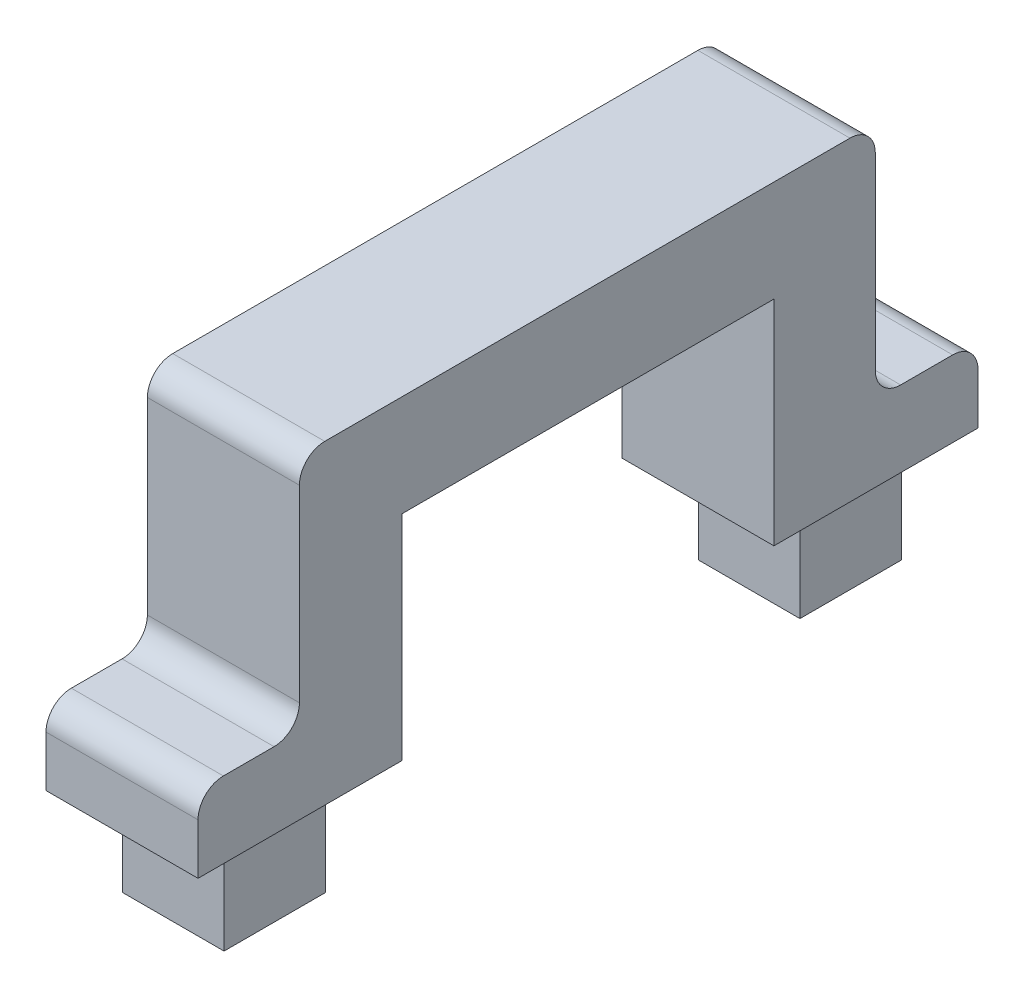
ISO-10303-21;
HEADER;
FILE_DESCRIPTION(('STEP AP214'),'2;1');
FILE_NAME('part.step','',(''),(''),'','','');
FILE_SCHEMA(('AUTOMOTIVE_DESIGN { 1 0 10303 214 1 1 1 1 }'));
ENDSEC;
DATA;
#1=APPLICATION_CONTEXT('core data for automotive mechanical design processes');
#2=APPLICATION_PROTOCOL_DEFINITION('international standard','automotive_design',2000,#1);
#3=PRODUCT_CONTEXT('',#1,'mechanical');
#4=PRODUCT('Part','Part','',(#3));
#5=PRODUCT_RELATED_PRODUCT_CATEGORY('part','',(#4));
#6=PRODUCT_DEFINITION_FORMATION('','',#4);
#7=PRODUCT_DEFINITION_CONTEXT('part definition',#1,'design');
#8=PRODUCT_DEFINITION('design','',#6,#7);
#9=PRODUCT_DEFINITION_SHAPE('','',#8);
#10=(LENGTH_UNIT() NAMED_UNIT(*) SI_UNIT(.MILLI.,.METRE.));
#11=(NAMED_UNIT(*) PLANE_ANGLE_UNIT() SI_UNIT($,.RADIAN.));
#12=(NAMED_UNIT(*) SI_UNIT($,.STERADIAN.) SOLID_ANGLE_UNIT());
#13=UNCERTAINTY_MEASURE_WITH_UNIT(LENGTH_MEASURE(1.E-05),#10,'distance_accuracy_value','');
#14=(GEOMETRIC_REPRESENTATION_CONTEXT(3) GLOBAL_UNCERTAINTY_ASSIGNED_CONTEXT((#13)) GLOBAL_UNIT_ASSIGNED_CONTEXT((#10,
#11,#12)) REPRESENTATION_CONTEXT('',''));
#15=CARTESIAN_POINT('',(0.,0.,0.));
#16=DIRECTION('',(0.,0.,1.));
#17=DIRECTION('',(1.,0.,0.));
#18=AXIS2_PLACEMENT_3D('',#15,#16,#17);
#19=CARTESIAN_POINT('',(9.525,0.,0.));
#20=DIRECTION('',(0.,1.,0.));
#21=DIRECTION('',(0.,0.,1.));
#22=AXIS2_PLACEMENT_3D('',#19,#20,#21);
#23=PLANE('',#22);
#24=DIRECTION('',(0.,0.,-1.));
#25=VECTOR('',#24,1.);
#26=CARTESIAN_POINT('',(0.,0.,0.));
#27=LINE('',#26,#25);
#28=CARTESIAN_POINT('',(0.,0.,0.));
#29=VERTEX_POINT('',#28);
#30=CARTESIAN_POINT('',(0.,0.,-12.7847852));
#31=VERTEX_POINT('',#30);
#32=EDGE_CURVE('E310',#29,#31,#27,.T.);
#33=ORIENTED_EDGE('',*,*,#32,.T.);
#34=DIRECTION('',(-1.,0.,0.));
#35=VECTOR('',#34,1.);
#36=CARTESIAN_POINT('',(9.525,0.,-12.7847852));
#37=LINE('',#36,#35);
#38=CARTESIAN_POINT('',(9.525,0.,-12.7847852));
#39=VERTEX_POINT('',#38);
#40=EDGE_CURVE('E348',#39,#31,#37,.T.);
#41=ORIENTED_EDGE('',*,*,#40,.F.);
#42=DIRECTION('',(0.,0.,-1.));
#43=VECTOR('',#42,1.);
#44=CARTESIAN_POINT('',(9.525,0.,0.));
#45=LINE('',#44,#43);
#46=CARTESIAN_POINT('',(9.525,0.,0.));
#47=VERTEX_POINT('',#46);
#48=EDGE_CURVE('E279',#47,#39,#45,.T.);
#49=ORIENTED_EDGE('',*,*,#48,.F.);
#50=DIRECTION('',(-1.,0.,0.));
#51=VECTOR('',#50,1.);
#52=CARTESIAN_POINT('',(9.525,0.,0.));
#53=LINE('',#52,#51);
#54=EDGE_CURVE('E351',#47,#29,#53,.T.);
#55=ORIENTED_EDGE('',*,*,#54,.T.);
#56=EDGE_LOOP('',(#33,#41,#49,#55));
#57=FACE_BOUND('',#56,.T.);
#58=DIRECTION('',(-1.,0.,0.));
#59=VECTOR('',#58,1.);
#60=CARTESIAN_POINT('',(1.5875,0.,-3.21739259999999));
#61=LINE('',#60,#59);
#62=CARTESIAN_POINT('',(7.93749999999999,0.,-3.21739259999999));
#63=VERTEX_POINT('',#62);
#64=CARTESIAN_POINT('',(1.5875,0.,-3.21739259999999));
#65=VERTEX_POINT('',#64);
#66=EDGE_CURVE('E225',#63,#65,#61,.T.);
#67=ORIENTED_EDGE('',*,*,#66,.F.);
#68=DIRECTION('',(0.,0.,1.));
#69=VECTOR('',#68,1.);
#70=CARTESIAN_POINT('',(7.93749999999999,0.,-3.21739259999999));
#71=LINE('',#70,#69);
#72=CARTESIAN_POINT('',(7.93749999999999,0.,-9.5673926));
#73=VERTEX_POINT('',#72);
#74=EDGE_CURVE('E222',#73,#63,#71,.T.);
#75=ORIENTED_EDGE('',*,*,#74,.F.);
#76=DIRECTION('',(1.,0.,0.));
#77=VECTOR('',#76,1.);
#78=CARTESIAN_POINT('',(1.5875,0.,-9.56739259999999));
#79=LINE('',#78,#77);
#80=CARTESIAN_POINT('',(1.5875,0.,-9.56739259999999));
#81=VERTEX_POINT('',#80);
#82=EDGE_CURVE('E53',#81,#73,#79,.T.);
#83=ORIENTED_EDGE('',*,*,#82,.F.);
#84=DIRECTION('',(0.,0.,-1.));
#85=VECTOR('',#84,1.);
#86=CARTESIAN_POINT('',(1.5875,0.,-3.21739259999999));
#87=LINE('',#86,#85);
#88=EDGE_CURVE('E48',#65,#81,#87,.T.);
#89=ORIENTED_EDGE('',*,*,#88,.F.);
#90=EDGE_LOOP('',(#67,#75,#83,#89));
#91=FACE_BOUND('',#90,.T.);
#92=ADVANCED_FACE('F33',(#57,#91),#23,.F.);
#93=CARTESIAN_POINT('',(9.525,0.,-48.8626404));
#94=DIRECTION('',(0.,1.,0.));
#95=DIRECTION('',(0.,0.,1.));
#96=AXIS2_PLACEMENT_3D('',#93,#94,#95);
#97=PLANE('',#96);
#98=DIRECTION('',(0.,0.,-1.));
#99=VECTOR('',#98,1.);
#100=CARTESIAN_POINT('',(0.,0.,-48.8626404));
#101=LINE('',#100,#99);
#102=CARTESIAN_POINT('',(0.,0.,-36.0778552));
#103=VERTEX_POINT('',#102);
#104=CARTESIAN_POINT('',(0.,0.,-48.8626404));
#105=VERTEX_POINT('',#104);
#106=EDGE_CURVE('E318',#103,#105,#101,.T.);
#107=ORIENTED_EDGE('',*,*,#106,.T.);
#108=DIRECTION('',(-1.,0.,0.));
#109=VECTOR('',#108,1.);
#110=CARTESIAN_POINT('',(9.525,0.,-48.8626404));
#111=LINE('',#110,#109);
#112=CARTESIAN_POINT('',(9.525,0.,-48.8626404));
#113=VERTEX_POINT('',#112);
#114=EDGE_CURVE('E308',#113,#105,#111,.T.);
#115=ORIENTED_EDGE('',*,*,#114,.F.);
#116=DIRECTION('',(0.,0.,-1.));
#117=VECTOR('',#116,1.);
#118=CARTESIAN_POINT('',(9.525,0.,-48.8626404));
#119=LINE('',#118,#117);
#120=CARTESIAN_POINT('',(9.525,0.,-36.0778552));
#121=VERTEX_POINT('',#120);
#122=EDGE_CURVE('E288',#121,#113,#119,.T.);
#123=ORIENTED_EDGE('',*,*,#122,.F.);
#124=DIRECTION('',(-1.,0.,0.));
#125=VECTOR('',#124,1.);
#126=CARTESIAN_POINT('',(9.525,0.,-36.0778552));
#127=LINE('',#126,#125);
#128=EDGE_CURVE('E339',#121,#103,#127,.T.);
#129=ORIENTED_EDGE('',*,*,#128,.T.);
#130=EDGE_LOOP('',(#107,#115,#123,#129));
#131=FACE_BOUND('',#130,.T.);
#132=DIRECTION('',(0.,0.,-1.));
#133=VECTOR('',#132,1.);
#134=CARTESIAN_POINT('',(1.5875,0.,-45.6452478));
#135=LINE('',#134,#133);
#136=CARTESIAN_POINT('',(1.5875,0.,-39.2952478));
#137=VERTEX_POINT('',#136);
#138=CARTESIAN_POINT('',(1.5875,0.,-45.6452478));
#139=VERTEX_POINT('',#138);
#140=EDGE_CURVE('E226',#137,#139,#135,.T.);
#141=ORIENTED_EDGE('',*,*,#140,.F.);
#142=DIRECTION('',(-1.,0.,0.));
#143=VECTOR('',#142,1.);
#144=CARTESIAN_POINT('',(1.5875,0.,-39.2952478));
#145=LINE('',#144,#143);
#146=CARTESIAN_POINT('',(7.9375,0.,-39.2952478));
#147=VERTEX_POINT('',#146);
#148=EDGE_CURVE('E239',#147,#137,#145,.T.);
#149=ORIENTED_EDGE('',*,*,#148,.F.);
#150=DIRECTION('',(0.,0.,1.));
#151=VECTOR('',#150,1.);
#152=CARTESIAN_POINT('',(7.9375,0.,-45.6452478));
#153=LINE('',#152,#151);
#154=CARTESIAN_POINT('',(7.9375,0.,-45.6452478));
#155=VERTEX_POINT('',#154);
#156=EDGE_CURVE('E248',#155,#147,#153,.T.);
#157=ORIENTED_EDGE('',*,*,#156,.F.);
#158=DIRECTION('',(1.,0.,0.));
#159=VECTOR('',#158,1.);
#160=CARTESIAN_POINT('',(1.5875,0.,-45.6452478));
#161=LINE('',#160,#159);
#162=EDGE_CURVE('E229',#139,#155,#161,.T.);
#163=ORIENTED_EDGE('',*,*,#162,.F.);
#164=EDGE_LOOP('',(#141,#149,#157,#163));
#165=FACE_BOUND('',#164,.T.);
#166=ADVANCED_FACE('F481',(#131,#165),#97,.F.);
#167=CARTESIAN_POINT('',(9.525,4.7625,0.));
#168=DIRECTION('',(0.,0.,-1.));
#169=DIRECTION('',(0.,1.,0.));
#170=AXIS2_PLACEMENT_3D('',#167,#168,#169);
#171=PLANE('',#170);
#172=DIRECTION('',(0.,-1.,0.));
#173=VECTOR('',#172,1.);
#174=CARTESIAN_POINT('',(9.525,4.7625,0.));
#175=LINE('',#174,#173);
#176=CARTESIAN_POINT('',(9.525,3.175,0.));
#177=VERTEX_POINT('',#176);
#178=EDGE_CURVE('E277',#177,#47,#175,.T.);
#179=ORIENTED_EDGE('',*,*,#178,.F.);
#180=DIRECTION('',(-1.,0.,0.));
#181=VECTOR('',#180,1.);
#182=CARTESIAN_POINT('',(9.525,3.175,0.));
#183=LINE('',#182,#181);
#184=CARTESIAN_POINT('',(0.,3.175,0.));
#185=VERTEX_POINT('',#184);
#186=EDGE_CURVE('E354',#177,#185,#183,.T.);
#187=ORIENTED_EDGE('',*,*,#186,.T.);
#188=DIRECTION('',(0.,-1.,0.));
#189=VECTOR('',#188,1.);
#190=CARTESIAN_POINT('',(0.,4.7625,0.));
#191=LINE('',#190,#189);
#192=EDGE_CURVE('E268',#185,#29,#191,.T.);
#193=ORIENTED_EDGE('',*,*,#192,.T.);
#194=ORIENTED_EDGE('',*,*,#54,.F.);
#195=EDGE_LOOP('',(#179,#187,#193,#194));
#196=FACE_BOUND('',#195,.T.);
#197=ADVANCED_FACE('F457',(#196),#171,.F.);
#198=CARTESIAN_POINT('',(9.525,0.,-12.7847852));
#199=DIRECTION('',(0.,0.,1.));
#200=DIRECTION('',(1.,0.,0.));
#201=AXIS2_PLACEMENT_3D('',#198,#199,#200);
#202=PLANE('',#201);
#203=DIRECTION('',(0.,1.,0.));
#204=VECTOR('',#203,1.);
#205=CARTESIAN_POINT('',(0.,0.,-12.7847852));
#206=LINE('',#205,#204);
#207=CARTESIAN_POINT('',(0.,13.390245,-12.7847852));
#208=VERTEX_POINT('',#207);
#209=EDGE_CURVE('E312',#31,#208,#206,.T.);
#210=ORIENTED_EDGE('',*,*,#209,.T.);
#211=DIRECTION('',(-1.,0.,0.));
#212=VECTOR('',#211,1.);
#213=CARTESIAN_POINT('',(9.525,13.390245,-12.7847852));
#214=LINE('',#213,#212);
#215=CARTESIAN_POINT('',(9.525,13.390245,-12.7847852));
#216=VERTEX_POINT('',#215);
#217=EDGE_CURVE('E345',#216,#208,#214,.T.);
#218=ORIENTED_EDGE('',*,*,#217,.F.);
#219=DIRECTION('',(0.,1.,0.));
#220=VECTOR('',#219,1.);
#221=CARTESIAN_POINT('',(9.525,0.,-12.7847852));
#222=LINE('',#221,#220);
#223=EDGE_CURVE('E282',#39,#216,#222,.T.);
#224=ORIENTED_EDGE('',*,*,#223,.F.);
#225=ORIENTED_EDGE('',*,*,#40,.T.);
#226=EDGE_LOOP('',(#210,#218,#224,#225));
#227=FACE_BOUND('',#226,.T.);
#228=ADVANCED_FACE('F466',(#227),#202,.F.);
#229=CARTESIAN_POINT('',(9.525,13.390245,-12.7847852));
#230=DIRECTION('',(0.,1.,0.));
#231=DIRECTION('',(0.,0.,1.));
#232=AXIS2_PLACEMENT_3D('',#229,#230,#231);
#233=PLANE('',#232);
#234=DIRECTION('',(0.,0.,-1.));
#235=VECTOR('',#234,1.);
#236=CARTESIAN_POINT('',(0.,13.390245,-12.7847852));
#237=LINE('',#236,#235);
#238=CARTESIAN_POINT('',(0.,13.390245,-36.0778552));
#239=VERTEX_POINT('',#238);
#240=EDGE_CURVE('E314',#208,#239,#237,.T.);
#241=ORIENTED_EDGE('',*,*,#240,.T.);
#242=DIRECTION('',(-1.,0.,0.));
#243=VECTOR('',#242,1.);
#244=CARTESIAN_POINT('',(9.525,13.390245,-36.0778552));
#245=LINE('',#244,#243);
#246=CARTESIAN_POINT('',(9.525,13.390245,-36.0778552));
#247=VERTEX_POINT('',#246);
#248=EDGE_CURVE('E342',#247,#239,#245,.T.);
#249=ORIENTED_EDGE('',*,*,#248,.F.);
#250=DIRECTION('',(0.,0.,-1.));
#251=VECTOR('',#250,1.);
#252=CARTESIAN_POINT('',(9.525,13.390245,-12.7847852));
#253=LINE('',#252,#251);
#254=EDGE_CURVE('E284',#216,#247,#253,.T.);
#255=ORIENTED_EDGE('',*,*,#254,.F.);
#256=ORIENTED_EDGE('',*,*,#217,.T.);
#257=EDGE_LOOP('',(#241,#249,#255,#256));
#258=FACE_BOUND('',#257,.T.);
#259=ADVANCED_FACE('F470',(#258),#233,.F.);
#260=CARTESIAN_POINT('',(9.525,13.390245,-36.0778552));
#261=DIRECTION('',(0.,0.,-1.));
#262=DIRECTION('',(-1.,0.,0.));
#263=AXIS2_PLACEMENT_3D('',#260,#261,#262);
#264=PLANE('',#263);
#265=DIRECTION('',(0.,-1.,0.));
#266=VECTOR('',#265,1.);
#267=CARTESIAN_POINT('',(0.,13.390245,-36.0778552));
#268=LINE('',#267,#266);
#269=EDGE_CURVE('E316',#239,#103,#268,.T.);
#270=ORIENTED_EDGE('',*,*,#269,.T.);
#271=ORIENTED_EDGE('',*,*,#128,.F.);
#272=DIRECTION('',(0.,-1.,0.));
#273=VECTOR('',#272,1.);
#274=CARTESIAN_POINT('',(9.525,13.390245,-36.0778552));
#275=LINE('',#274,#273);
#276=EDGE_CURVE('E286',#247,#121,#275,.T.);
#277=ORIENTED_EDGE('',*,*,#276,.F.);
#278=ORIENTED_EDGE('',*,*,#248,.T.);
#279=EDGE_LOOP('',(#270,#271,#277,#278));
#280=FACE_BOUND('',#279,.T.);
#281=ADVANCED_FACE('F475',(#280),#264,.F.);
#282=CARTESIAN_POINT('',(9.525,4.7625,-48.8626404));
#283=DIRECTION('',(0.,0.,1.));
#284=DIRECTION('',(1.,0.,0.));
#285=AXIS2_PLACEMENT_3D('',#282,#283,#284);
#286=PLANE('',#285);
#287=DIRECTION('',(0.,1.,0.));
#288=VECTOR('',#287,1.);
#289=CARTESIAN_POINT('',(0.,4.7625,-48.8626404));
#290=LINE('',#289,#288);
#291=CARTESIAN_POINT('',(0.,3.175,-48.8626404));
#292=VERTEX_POINT('',#291);
#293=EDGE_CURVE('E320',#105,#292,#290,.T.);
#294=ORIENTED_EDGE('',*,*,#293,.T.);
#295=DIRECTION('',(-1.,0.,0.));
#296=VECTOR('',#295,1.);
#297=CARTESIAN_POINT('',(9.525,3.175,-48.8626404));
#298=LINE('',#297,#296);
#299=CARTESIAN_POINT('',(9.525,3.175,-48.8626404));
#300=VERTEX_POINT('',#299);
#301=EDGE_CURVE('E398',#292,#300,#298,.F.);
#302=ORIENTED_EDGE('',*,*,#301,.T.);
#303=DIRECTION('',(0.,1.,0.));
#304=VECTOR('',#303,1.);
#305=CARTESIAN_POINT('',(9.525,4.7625,-48.8626404));
#306=LINE('',#305,#304);
#307=EDGE_CURVE('E290',#113,#300,#306,.T.);
#308=ORIENTED_EDGE('',*,*,#307,.F.);
#309=ORIENTED_EDGE('',*,*,#114,.T.);
#310=EDGE_LOOP('',(#294,#302,#308,#309));
#311=FACE_BOUND('',#310,.T.);
#312=ADVANCED_FACE('F486',(#311),#286,.F.);
#313=CARTESIAN_POINT('',(9.525,4.7625,-42.4278552));
#314=DIRECTION('',(0.,-1.,0.));
#315=DIRECTION('',(0.,0.,-1.));
#316=AXIS2_PLACEMENT_3D('',#313,#314,#315);
#317=PLANE('',#316);
#318=DIRECTION('',(0.,0.,1.));
#319=VECTOR('',#318,1.);
#320=CARTESIAN_POINT('',(9.525,4.7625,-42.4278552));
#321=LINE('',#320,#319);
#322=CARTESIAN_POINT('',(9.525,4.7625,-47.2751404));
#323=VERTEX_POINT('',#322);
#324=CARTESIAN_POINT('',(9.525,4.7625,-44.0153552));
#325=VERTEX_POINT('',#324);
#326=EDGE_CURVE('E293',#323,#325,#321,.T.);
#327=ORIENTED_EDGE('',*,*,#326,.F.);
#328=DIRECTION('',(-1.,0.,0.));
#329=VECTOR('',#328,1.);
#330=CARTESIAN_POINT('',(9.525,4.7625,-47.2751404));
#331=LINE('',#330,#329);
#332=CARTESIAN_POINT('',(0.,4.7625,-47.2751404));
#333=VERTEX_POINT('',#332);
#334=EDGE_CURVE('E395',#323,#333,#331,.T.);
#335=ORIENTED_EDGE('',*,*,#334,.T.);
#336=DIRECTION('',(0.,0.,1.));
#337=VECTOR('',#336,1.);
#338=CARTESIAN_POINT('',(0.,4.7625,-42.4278552));
#339=LINE('',#338,#337);
#340=CARTESIAN_POINT('',(0.,4.7625,-44.0153552));
#341=VERTEX_POINT('',#340);
#342=EDGE_CURVE('E323',#333,#341,#339,.T.);
#343=ORIENTED_EDGE('',*,*,#342,.T.);
#344=DIRECTION('',(-1.,0.,0.));
#345=VECTOR('',#344,1.);
#346=CARTESIAN_POINT('',(9.525,4.7625,-44.0153552));
#347=LINE('',#346,#345);
#348=EDGE_CURVE('E393',#341,#325,#347,.F.);
#349=ORIENTED_EDGE('',*,*,#348,.T.);
#350=EDGE_LOOP('',(#327,#335,#343,#349));
#351=FACE_BOUND('',#350,.T.);
#352=ADVANCED_FACE('F413',(#351),#317,.F.);
#353=CARTESIAN_POINT('',(9.525,19.740245,-42.4278552));
#354=DIRECTION('',(0.,0.,1.));
#355=DIRECTION('',(1.,0.,0.));
#356=AXIS2_PLACEMENT_3D('',#353,#354,#355);
#357=PLANE('',#356);
#358=DIRECTION('',(0.,1.,0.));
#359=VECTOR('',#358,1.);
#360=CARTESIAN_POINT('',(0.,19.740245,-42.4278552));
#361=LINE('',#360,#359);
#362=CARTESIAN_POINT('',(0.,6.35,-42.4278552));
#363=VERTEX_POINT('',#362);
#364=CARTESIAN_POINT('',(0.,18.152745,-42.4278552));
#365=VERTEX_POINT('',#364);
#366=EDGE_CURVE('E326',#363,#365,#361,.T.);
#367=ORIENTED_EDGE('',*,*,#366,.T.);
#368=DIRECTION('',(-1.,0.,0.));
#369=VECTOR('',#368,1.);
#370=CARTESIAN_POINT('',(9.525,18.152745,-42.4278552));
#371=LINE('',#370,#369);
#372=CARTESIAN_POINT('',(9.525,18.152745,-42.4278552));
#373=VERTEX_POINT('',#372);
#374=EDGE_CURVE('E391',#365,#373,#371,.F.);
#375=ORIENTED_EDGE('',*,*,#374,.T.);
#376=DIRECTION('',(0.,1.,0.));
#377=VECTOR('',#376,1.);
#378=CARTESIAN_POINT('',(9.525,19.740245,-42.4278552));
#379=LINE('',#378,#377);
#380=CARTESIAN_POINT('',(9.525,6.35,-42.4278552));
#381=VERTEX_POINT('',#380);
#382=EDGE_CURVE('E296',#381,#373,#379,.T.);
#383=ORIENTED_EDGE('',*,*,#382,.F.);
#384=DIRECTION('',(-1.,0.,0.));
#385=VECTOR('',#384,1.);
#386=CARTESIAN_POINT('',(0.,6.35,-42.4278552));
#387=LINE('',#386,#385);
#388=EDGE_CURVE('E388',#381,#363,#387,.T.);
#389=ORIENTED_EDGE('',*,*,#388,.T.);
#390=EDGE_LOOP('',(#367,#375,#383,#389));
#391=FACE_BOUND('',#390,.T.);
#392=ADVANCED_FACE('F421',(#391),#357,.F.);
#393=CARTESIAN_POINT('',(9.525,19.740245,-6.3509652));
#394=DIRECTION('',(0.,-1.,0.));
#395=DIRECTION('',(0.,0.,-1.));
#396=AXIS2_PLACEMENT_3D('',#393,#394,#395);
#397=PLANE('',#396);
#398=DIRECTION('',(0.,0.,1.));
#399=VECTOR('',#398,1.);
#400=CARTESIAN_POINT('',(0.,19.740245,-6.3509652));
#401=LINE('',#400,#399);
#402=CARTESIAN_POINT('',(0.,19.740245,-40.8403552));
#403=VERTEX_POINT('',#402);
#404=CARTESIAN_POINT('',(0.,19.740245,-7.9384652));
#405=VERTEX_POINT('',#404);
#406=EDGE_CURVE('E329',#403,#405,#401,.T.);
#407=ORIENTED_EDGE('',*,*,#406,.T.);
#408=DIRECTION('',(-1.,0.,0.));
#409=VECTOR('',#408,1.);
#410=CARTESIAN_POINT('',(9.525,19.740245,-7.9384652));
#411=LINE('',#410,#409);
#412=CARTESIAN_POINT('',(9.525,19.740245,-7.93846519999999));
#413=VERTEX_POINT('',#412);
#414=EDGE_CURVE('E386',#405,#413,#411,.F.);
#415=ORIENTED_EDGE('',*,*,#414,.T.);
#416=DIRECTION('',(0.,0.,1.));
#417=VECTOR('',#416,1.);
#418=CARTESIAN_POINT('',(9.525,19.740245,-41.4309052));
#419=LINE('',#418,#417);
#420=CARTESIAN_POINT('',(9.525,19.740245,-40.8403552));
#421=VERTEX_POINT('',#420);
#422=EDGE_CURVE('E299',#421,#413,#419,.T.);
#423=ORIENTED_EDGE('',*,*,#422,.F.);
#424=DIRECTION('',(-1.,0.,0.));
#425=VECTOR('',#424,1.);
#426=CARTESIAN_POINT('',(9.525,19.740245,-40.8403552));
#427=LINE('',#426,#425);
#428=EDGE_CURVE('E383',#421,#403,#427,.T.);
#429=ORIENTED_EDGE('',*,*,#428,.T.);
#430=EDGE_LOOP('',(#407,#415,#423,#429));
#431=FACE_BOUND('',#430,.T.);
#432=ADVANCED_FACE('F429',(#431),#397,.F.);
#433=CARTESIAN_POINT('',(9.525,19.740245,-6.3509652));
#434=DIRECTION('',(0.,0.,-1.));
#435=DIRECTION('',(0.,1.,0.));
#436=AXIS2_PLACEMENT_3D('',#433,#434,#435);
#437=PLANE('',#436);
#438=DIRECTION('',(0.,-1.,0.));
#439=VECTOR('',#438,1.);
#440=CARTESIAN_POINT('',(0.,19.740245,-6.3509652));
#441=LINE('',#440,#439);
#442=CARTESIAN_POINT('',(0.,18.152745,-6.3509652));
#443=VERTEX_POINT('',#442);
#444=CARTESIAN_POINT('',(0.,6.35,-6.3509652));
#445=VERTEX_POINT('',#444);
#446=EDGE_CURVE('E332',#443,#445,#441,.T.);
#447=ORIENTED_EDGE('',*,*,#446,.T.);
#448=DIRECTION('',(-1.,0.,0.));
#449=VECTOR('',#448,1.);
#450=CARTESIAN_POINT('',(9.525,6.35,-6.3509652));
#451=LINE('',#450,#449);
#452=CARTESIAN_POINT('',(9.525,6.35,-6.3509652));
#453=VERTEX_POINT('',#452);
#454=EDGE_CURVE('E381',#445,#453,#451,.F.);
#455=ORIENTED_EDGE('',*,*,#454,.T.);
#456=DIRECTION('',(0.,-1.,0.));
#457=VECTOR('',#456,1.);
#458=CARTESIAN_POINT('',(9.525,19.740245,-6.3509652));
#459=LINE('',#458,#457);
#460=CARTESIAN_POINT('',(9.525,18.152745,-6.3509652));
#461=VERTEX_POINT('',#460);
#462=EDGE_CURVE('E302',#461,#453,#459,.T.);
#463=ORIENTED_EDGE('',*,*,#462,.F.);
#464=DIRECTION('',(-1.,0.,0.));
#465=VECTOR('',#464,1.);
#466=CARTESIAN_POINT('',(9.525,18.152745,-6.3509652));
#467=LINE('',#466,#465);
#468=EDGE_CURVE('E378',#461,#443,#467,.T.);
#469=ORIENTED_EDGE('',*,*,#468,.T.);
#470=EDGE_LOOP('',(#447,#455,#463,#469));
#471=FACE_BOUND('',#470,.T.);
#472=ADVANCED_FACE('F438',(#471),#437,.F.);
#473=CARTESIAN_POINT('',(9.525,4.7625,-6.3509652));
#474=DIRECTION('',(0.,-1.,0.));
#475=DIRECTION('',(0.,0.,-1.));
#476=AXIS2_PLACEMENT_3D('',#473,#474,#475);
#477=PLANE('',#476);
#478=DIRECTION('',(0.,0.,1.));
#479=VECTOR('',#478,1.);
#480=CARTESIAN_POINT('',(0.,4.7625,-6.3509652));
#481=LINE('',#480,#479);
#482=CARTESIAN_POINT('',(0.,4.7625,-4.7634652));
#483=VERTEX_POINT('',#482);
#484=CARTESIAN_POINT('',(0.,4.7625,-1.5875));
#485=VERTEX_POINT('',#484);
#486=EDGE_CURVE('E280',#483,#485,#481,.T.);
#487=ORIENTED_EDGE('',*,*,#486,.T.);
#488=DIRECTION('',(-1.,0.,0.));
#489=VECTOR('',#488,1.);
#490=CARTESIAN_POINT('',(9.525,4.7625,-1.5875));
#491=LINE('',#490,#489);
#492=CARTESIAN_POINT('',(9.525,4.7625,-1.5875));
#493=VERTEX_POINT('',#492);
#494=EDGE_CURVE('E368',#485,#493,#491,.F.);
#495=ORIENTED_EDGE('',*,*,#494,.T.);
#496=DIRECTION('',(0.,0.,1.));
#497=VECTOR('',#496,1.);
#498=CARTESIAN_POINT('',(9.525,4.7625,-6.3509652));
#499=LINE('',#498,#497);
#500=CARTESIAN_POINT('',(9.525,4.7625,-4.7634652));
#501=VERTEX_POINT('',#500);
#502=EDGE_CURVE('E305',#501,#493,#499,.T.);
#503=ORIENTED_EDGE('',*,*,#502,.F.);
#504=DIRECTION('',(-1.,0.,0.));
#505=VECTOR('',#504,1.);
#506=CARTESIAN_POINT('',(0.,4.7625,-4.7634652));
#507=LINE('',#506,#505);
#508=EDGE_CURVE('E365',#501,#483,#507,.T.);
#509=ORIENTED_EDGE('',*,*,#508,.T.);
#510=EDGE_LOOP('',(#487,#495,#503,#509));
#511=FACE_BOUND('',#510,.T.);
#512=ADVANCED_FACE('F447',(#511),#477,.F.);
#513=CARTESIAN_POINT('',(9.525,0.,0.));
#514=DIRECTION('',(1.,0.,0.));
#515=DIRECTION('',(0.,0.,-1.));
#516=AXIS2_PLACEMENT_3D('',#513,#514,#515);
#517=PLANE('',#516);
#518=ORIENTED_EDGE('',*,*,#502,.T.);
#519=CARTESIAN_POINT('',(9.525,3.175,-1.5875));
#520=DIRECTION('',(1.,0.,0.));
#521=DIRECTION('',(0.,0.,-1.));
#522=AXIS2_PLACEMENT_3D('',#519,#520,#521);
#523=CIRCLE('',#522,1.5875);
#524=EDGE_CURVE('E376',#493,#177,#523,.T.);
#525=ORIENTED_EDGE('',*,*,#524,.T.);
#526=ORIENTED_EDGE('',*,*,#178,.T.);
#527=ORIENTED_EDGE('',*,*,#48,.T.);
#528=ORIENTED_EDGE('',*,*,#223,.T.);
#529=ORIENTED_EDGE('',*,*,#254,.T.);
#530=ORIENTED_EDGE('',*,*,#276,.T.);
#531=ORIENTED_EDGE('',*,*,#122,.T.);
#532=ORIENTED_EDGE('',*,*,#307,.T.);
#533=CARTESIAN_POINT('',(9.525,3.175,-47.2751404));
#534=DIRECTION('',(1.,0.,0.));
#535=DIRECTION('',(0.,0.,-1.));
#536=AXIS2_PLACEMENT_3D('',#533,#534,#535);
#537=CIRCLE('',#536,1.5875);
#538=EDGE_CURVE('E370',#300,#323,#537,.T.);
#539=ORIENTED_EDGE('',*,*,#538,.T.);
#540=ORIENTED_EDGE('',*,*,#326,.T.);
#541=CARTESIAN_POINT('',(9.525,6.35,-44.0153552));
#542=DIRECTION('',(1.,0.,0.));
#543=DIRECTION('',(0.,0.,-1.));
#544=AXIS2_PLACEMENT_3D('',#541,#542,#543);
#545=CIRCLE('',#544,1.5875);
#546=EDGE_CURVE('E11',#325,#381,#545,.F.);
#547=ORIENTED_EDGE('',*,*,#546,.T.);
#548=ORIENTED_EDGE('',*,*,#382,.T.);
#549=CARTESIAN_POINT('',(9.525,18.152745,-40.8403552));
#550=DIRECTION('',(1.,0.,0.));
#551=DIRECTION('',(0.,0.,-1.));
#552=AXIS2_PLACEMENT_3D('',#549,#550,#551);
#553=CIRCLE('',#552,1.5875);
#554=EDGE_CURVE('E372',#373,#421,#553,.T.);
#555=ORIENTED_EDGE('',*,*,#554,.T.);
#556=ORIENTED_EDGE('',*,*,#422,.T.);
#557=CARTESIAN_POINT('',(9.525,18.152745,-7.9384652));
#558=DIRECTION('',(1.,0.,0.));
#559=DIRECTION('',(0.,0.,-1.));
#560=AXIS2_PLACEMENT_3D('',#557,#558,#559);
#561=CIRCLE('',#560,1.5875);
#562=EDGE_CURVE('E374',#413,#461,#561,.T.);
#563=ORIENTED_EDGE('',*,*,#562,.T.);
#564=ORIENTED_EDGE('',*,*,#462,.T.);
#565=CARTESIAN_POINT('',(9.525,6.35,-4.7634652));
#566=DIRECTION('',(1.,0.,0.));
#567=DIRECTION('',(0.,0.,-1.));
#568=AXIS2_PLACEMENT_3D('',#565,#566,#567);
#569=CIRCLE('',#568,1.5875);
#570=EDGE_CURVE('E402',#453,#501,#569,.F.);
#571=ORIENTED_EDGE('',*,*,#570,.T.);
#572=EDGE_LOOP('',(#518,#525,#526,#527,#528,#529,#530,#531,#532,#539,#540,#547,#548,#555,#556,
#563,#564,#571));
#573=FACE_BOUND('',#572,.T.);
#574=ADVANCED_FACE('F418',(#573),#517,.T.);
#575=CARTESIAN_POINT('',(0.,0.,0.));
#576=DIRECTION('',(1.,0.,0.));
#577=DIRECTION('',(0.,0.,-1.));
#578=AXIS2_PLACEMENT_3D('',#575,#576,#577);
#579=PLANE('',#578);
#580=CARTESIAN_POINT('',(0.,6.68528,-38.3232152));
#581=DIRECTION('',(-1.,0.,0.));
#582=DIRECTION('',(0.,0.,1.));
#583=AXIS2_PLACEMENT_3D('',#580,#581,#582);
#584=CIRCLE('',#583,0.508000000000002);
#585=CARTESIAN_POINT('',(0.,6.68528,-37.8152152));
#586=VERTEX_POINT('',#585);
#587=EDGE_CURVE('E269',#586,#586,#584,.T.);
#588=ORIENTED_EDGE('',*,*,#587,.F.);
#589=EDGE_LOOP('',(#588));
#590=FACE_BOUND('',#589,.T.);
#591=CARTESIAN_POINT('',(0.,6.6951225,-10.5229152));
#592=DIRECTION('',(-1.,0.,0.));
#593=DIRECTION('',(0.,0.,1.));
#594=AXIS2_PLACEMENT_3D('',#591,#592,#593);
#595=CIRCLE('',#594,0.508000000000002);
#596=CARTESIAN_POINT('',(0.,6.6951225,-10.0149152));
#597=VERTEX_POINT('',#596);
#598=EDGE_CURVE('E264',#597,#597,#595,.T.);
#599=ORIENTED_EDGE('',*,*,#598,.F.);
#600=EDGE_LOOP('',(#599));
#601=FACE_BOUND('',#600,.T.);
#602=ORIENTED_EDGE('',*,*,#192,.F.);
#603=CARTESIAN_POINT('',(0.,3.175,-1.5875));
#604=DIRECTION('',(1.,0.,0.));
#605=DIRECTION('',(0.,0.,-1.));
#606=AXIS2_PLACEMENT_3D('',#603,#604,#605);
#607=CIRCLE('',#606,1.5875);
#608=EDGE_CURVE('E363',#185,#485,#607,.F.);
#609=ORIENTED_EDGE('',*,*,#608,.T.);
#610=ORIENTED_EDGE('',*,*,#486,.F.);
#611=CARTESIAN_POINT('',(0.,6.35,-4.7634652));
#612=DIRECTION('',(1.,0.,0.));
#613=DIRECTION('',(0.,0.,-1.));
#614=AXIS2_PLACEMENT_3D('',#611,#612,#613);
#615=CIRCLE('',#614,1.5875);
#616=EDGE_CURVE('E400',#483,#445,#615,.T.);
#617=ORIENTED_EDGE('',*,*,#616,.T.);
#618=ORIENTED_EDGE('',*,*,#446,.F.);
#619=CARTESIAN_POINT('',(0.,18.152745,-7.9384652));
#620=DIRECTION('',(1.,0.,0.));
#621=DIRECTION('',(0.,0.,-1.));
#622=AXIS2_PLACEMENT_3D('',#619,#620,#621);
#623=CIRCLE('',#622,1.5875);
#624=EDGE_CURVE('E361',#443,#405,#623,.F.);
#625=ORIENTED_EDGE('',*,*,#624,.T.);
#626=ORIENTED_EDGE('',*,*,#406,.F.);
#627=CARTESIAN_POINT('',(0.,18.152745,-40.8403552));
#628=DIRECTION('',(1.,0.,0.));
#629=DIRECTION('',(0.,0.,-1.));
#630=AXIS2_PLACEMENT_3D('',#627,#628,#629);
#631=CIRCLE('',#630,1.5875);
#632=EDGE_CURVE('E359',#403,#365,#631,.F.);
#633=ORIENTED_EDGE('',*,*,#632,.T.);
#634=ORIENTED_EDGE('',*,*,#366,.F.);
#635=CARTESIAN_POINT('',(0.,6.35,-44.0153552));
#636=DIRECTION('',(1.,0.,0.));
#637=DIRECTION('',(0.,0.,-1.));
#638=AXIS2_PLACEMENT_3D('',#635,#636,#637);
#639=CIRCLE('',#638,1.5875);
#640=EDGE_CURVE('E41',#363,#341,#639,.T.);
#641=ORIENTED_EDGE('',*,*,#640,.T.);
#642=ORIENTED_EDGE('',*,*,#342,.F.);
#643=CARTESIAN_POINT('',(0.,3.175,-47.2751404));
#644=DIRECTION('',(1.,0.,0.));
#645=DIRECTION('',(0.,0.,-1.));
#646=AXIS2_PLACEMENT_3D('',#643,#644,#645);
#647=CIRCLE('',#646,1.5875);
#648=EDGE_CURVE('E357',#333,#292,#647,.F.);
#649=ORIENTED_EDGE('',*,*,#648,.T.);
#650=ORIENTED_EDGE('',*,*,#293,.F.);
#651=ORIENTED_EDGE('',*,*,#106,.F.);
#652=ORIENTED_EDGE('',*,*,#269,.F.);
#653=ORIENTED_EDGE('',*,*,#240,.F.);
#654=ORIENTED_EDGE('',*,*,#209,.F.);
#655=ORIENTED_EDGE('',*,*,#32,.F.);
#656=EDGE_LOOP('',(#602,#609,#610,#617,#618,#625,#626,#633,#634,#641,#642,#649,#650,#651,#652,
#653,#654,#655));
#657=FACE_BOUND('',#656,.T.);
#658=ADVANCED_FACE('F407',(#590,#601,#657),#579,.F.);
#659=CARTESIAN_POINT('',(6.35,6.6951225,-10.5229152));
#660=DIRECTION('',(-1.,0.,0.));
#661=DIRECTION('',(0.,0.,1.));
#662=AXIS2_PLACEMENT_3D('',#659,#660,#661);
#663=CYLINDRICAL_SURFACE('',#662,0.508000000000002);
#664=CARTESIAN_POINT('',(6.35,6.6951225,-10.5229152));
#665=DIRECTION('',(-1.,0.,0.));
#666=DIRECTION('',(0.,0.,1.));
#667=AXIS2_PLACEMENT_3D('',#664,#665,#666);
#668=CIRCLE('',#667,0.508000000000002);
#669=CARTESIAN_POINT('',(6.35,6.6951225,-10.0149152));
#670=VERTEX_POINT('',#669);
#671=EDGE_CURVE('E272',#670,#670,#668,.T.);
#672=ORIENTED_EDGE('',*,*,#671,.F.);
#673=EDGE_LOOP('',(#672));
#674=FACE_BOUND('',#673,.T.);
#675=ORIENTED_EDGE('',*,*,#598,.T.);
#676=EDGE_LOOP('',(#675));
#677=FACE_BOUND('',#676,.T.);
#678=ADVANCED_FACE('F650',(#674,#677),#663,.F.);
#679=CARTESIAN_POINT('',(6.35,6.6951225,-10.5229152));
#680=DIRECTION('',(-1.,0.,0.));
#681=DIRECTION('',(0.,0.,1.));
#682=AXIS2_PLACEMENT_3D('',#679,#680,#681);
#683=PLANE('',#682);
#684=ORIENTED_EDGE('',*,*,#671,.T.);
#685=EDGE_LOOP('',(#684));
#686=FACE_BOUND('',#685,.T.);
#687=ADVANCED_FACE('F646',(#686),#683,.T.);
#688=CARTESIAN_POINT('',(6.35,6.68528,-38.3232152));
#689=DIRECTION('',(-1.,0.,0.));
#690=DIRECTION('',(0.,0.,1.));
#691=AXIS2_PLACEMENT_3D('',#688,#689,#690);
#692=CYLINDRICAL_SURFACE('',#691,0.508000000000002);
#693=CARTESIAN_POINT('',(6.35,6.68528,-38.3232152));
#694=DIRECTION('',(-1.,0.,0.));
#695=DIRECTION('',(0.,0.,1.));
#696=AXIS2_PLACEMENT_3D('',#693,#694,#695);
#697=CIRCLE('',#696,0.508000000000002);
#698=CARTESIAN_POINT('',(6.35,6.68528,-37.8152152));
#699=VERTEX_POINT('',#698);
#700=EDGE_CURVE('E265',#699,#699,#697,.T.);
#701=ORIENTED_EDGE('',*,*,#700,.F.);
#702=EDGE_LOOP('',(#701));
#703=FACE_BOUND('',#702,.T.);
#704=ORIENTED_EDGE('',*,*,#587,.T.);
#705=EDGE_LOOP('',(#704));
#706=FACE_BOUND('',#705,.T.);
#707=ADVANCED_FACE('F642',(#703,#706),#692,.F.);
#708=CARTESIAN_POINT('',(6.35,6.68528,-38.3232152));
#709=DIRECTION('',(-1.,0.,0.));
#710=DIRECTION('',(0.,0.,1.));
#711=AXIS2_PLACEMENT_3D('',#708,#709,#710);
#712=PLANE('',#711);
#713=ORIENTED_EDGE('',*,*,#700,.T.);
#714=EDGE_LOOP('',(#713));
#715=FACE_BOUND('',#714,.T.);
#716=ADVANCED_FACE('F510',(#715),#712,.T.);
#717=CARTESIAN_POINT('',(9.525,3.175,-1.5875));
#718=DIRECTION('',(-1.,0.,0.));
#719=DIRECTION('',(0.,0.,1.));
#720=AXIS2_PLACEMENT_3D('',#717,#718,#719);
#721=CYLINDRICAL_SURFACE('',#720,1.5875);
#722=ORIENTED_EDGE('',*,*,#524,.F.);
#723=ORIENTED_EDGE('',*,*,#494,.F.);
#724=ORIENTED_EDGE('',*,*,#608,.F.);
#725=ORIENTED_EDGE('',*,*,#186,.F.);
#726=EDGE_LOOP('',(#722,#723,#724,#725));
#727=FACE_BOUND('',#726,.T.);
#728=ADVANCED_FACE('F451',(#727),#721,.T.);
#729=CARTESIAN_POINT('',(9.525,6.35,-4.7634652));
#730=DIRECTION('',(1.,0.,0.));
#731=DIRECTION('',(0.,0.,-1.));
#732=AXIS2_PLACEMENT_3D('',#729,#730,#731);
#733=CYLINDRICAL_SURFACE('',#732,1.5875);
#734=ORIENTED_EDGE('',*,*,#570,.F.);
#735=ORIENTED_EDGE('',*,*,#454,.F.);
#736=ORIENTED_EDGE('',*,*,#616,.F.);
#737=ORIENTED_EDGE('',*,*,#508,.F.);
#738=EDGE_LOOP('',(#734,#735,#736,#737));
#739=FACE_BOUND('',#738,.T.);
#740=ADVANCED_FACE('F442',(#739),#733,.F.);
#741=CARTESIAN_POINT('',(9.525,18.152745,-7.9384652));
#742=DIRECTION('',(-1.,0.,0.));
#743=DIRECTION('',(0.,0.,1.));
#744=AXIS2_PLACEMENT_3D('',#741,#742,#743);
#745=CYLINDRICAL_SURFACE('',#744,1.5875);
#746=ORIENTED_EDGE('',*,*,#562,.F.);
#747=ORIENTED_EDGE('',*,*,#414,.F.);
#748=ORIENTED_EDGE('',*,*,#624,.F.);
#749=ORIENTED_EDGE('',*,*,#468,.F.);
#750=EDGE_LOOP('',(#746,#747,#748,#749));
#751=FACE_BOUND('',#750,.T.);
#752=ADVANCED_FACE('F433',(#751),#745,.T.);
#753=CARTESIAN_POINT('',(9.525,18.152745,-40.8403552));
#754=DIRECTION('',(-1.,0.,0.));
#755=DIRECTION('',(0.,0.,1.));
#756=AXIS2_PLACEMENT_3D('',#753,#754,#755);
#757=CYLINDRICAL_SURFACE('',#756,1.5875);
#758=ORIENTED_EDGE('',*,*,#554,.F.);
#759=ORIENTED_EDGE('',*,*,#374,.F.);
#760=ORIENTED_EDGE('',*,*,#632,.F.);
#761=ORIENTED_EDGE('',*,*,#428,.F.);
#762=EDGE_LOOP('',(#758,#759,#760,#761));
#763=FACE_BOUND('',#762,.T.);
#764=ADVANCED_FACE('F424',(#763),#757,.T.);
#765=CARTESIAN_POINT('',(9.525,3.175,-47.2751404));
#766=DIRECTION('',(-1.,0.,0.));
#767=DIRECTION('',(0.,0.,1.));
#768=AXIS2_PLACEMENT_3D('',#765,#766,#767);
#769=CYLINDRICAL_SURFACE('',#768,1.5875);
#770=ORIENTED_EDGE('',*,*,#538,.F.);
#771=ORIENTED_EDGE('',*,*,#301,.F.);
#772=ORIENTED_EDGE('',*,*,#648,.F.);
#773=ORIENTED_EDGE('',*,*,#334,.F.);
#774=EDGE_LOOP('',(#770,#771,#772,#773));
#775=FACE_BOUND('',#774,.T.);
#776=ADVANCED_FACE('F489',(#775),#769,.T.);
#777=CARTESIAN_POINT('',(9.525,6.35,-44.0153552));
#778=DIRECTION('',(1.,0.,0.));
#779=DIRECTION('',(0.,0.,-1.));
#780=AXIS2_PLACEMENT_3D('',#777,#778,#779);
#781=CYLINDRICAL_SURFACE('',#780,1.5875);
#782=ORIENTED_EDGE('',*,*,#546,.F.);
#783=ORIENTED_EDGE('',*,*,#348,.F.);
#784=ORIENTED_EDGE('',*,*,#640,.F.);
#785=ORIENTED_EDGE('',*,*,#388,.F.);
#786=EDGE_LOOP('',(#782,#783,#784,#785));
#787=FACE_BOUND('',#786,.T.);
#788=ADVANCED_FACE('F35',(#787),#781,.F.);
#789=CARTESIAN_POINT('',(1.5875,-6.34999999999999,-45.6452478));
#790=DIRECTION('',(1.,0.,0.));
#791=DIRECTION('',(0.,0.,-1.));
#792=AXIS2_PLACEMENT_3D('',#789,#790,#791);
#793=PLANE('',#792);
#794=ORIENTED_EDGE('',*,*,#140,.T.);
#795=DIRECTION('',(0.,1.,0.));
#796=VECTOR('',#795,1.);
#797=CARTESIAN_POINT('',(1.5875,-6.34999999999999,-45.6452478));
#798=LINE('',#797,#796);
#799=CARTESIAN_POINT('',(1.5875,-6.34999999999999,-45.6452478));
#800=VERTEX_POINT('',#799);
#801=EDGE_CURVE('E261',#800,#139,#798,.T.);
#802=ORIENTED_EDGE('',*,*,#801,.F.);
#803=DIRECTION('',(0.,0.,-1.));
#804=VECTOR('',#803,1.);
#805=CARTESIAN_POINT('',(1.5875,-6.34999999999999,-45.6452478));
#806=LINE('',#805,#804);
#807=CARTESIAN_POINT('',(1.5875,-6.34999999999999,-39.2952478));
#808=VERTEX_POINT('',#807);
#809=EDGE_CURVE('E235',#808,#800,#806,.T.);
#810=ORIENTED_EDGE('',*,*,#809,.F.);
#811=DIRECTION('',(0.,1.,0.));
#812=VECTOR('',#811,1.);
#813=CARTESIAN_POINT('',(1.5875,-6.34999999999999,-39.2952478));
#814=LINE('',#813,#812);
#815=EDGE_CURVE('E244',#808,#137,#814,.T.);
#816=ORIENTED_EDGE('',*,*,#815,.T.);
#817=EDGE_LOOP('',(#794,#802,#810,#816));
#818=FACE_BOUND('',#817,.T.);
#819=ADVANCED_FACE('F495',(#818),#793,.F.);
#820=CARTESIAN_POINT('',(1.5875,-6.34999999999999,-45.6452478));
#821=DIRECTION('',(0.,0.,1.));
#822=DIRECTION('',(0.,-1.,0.));
#823=AXIS2_PLACEMENT_3D('',#820,#821,#822);
#824=PLANE('',#823);
#825=ORIENTED_EDGE('',*,*,#162,.T.);
#826=DIRECTION('',(0.,1.,0.));
#827=VECTOR('',#826,1.);
#828=CARTESIAN_POINT('',(7.9375,-6.34999999999999,-45.6452478));
#829=LINE('',#828,#827);
#830=CARTESIAN_POINT('',(7.9375,-6.34999999999999,-45.6452478));
#831=VERTEX_POINT('',#830);
#832=EDGE_CURVE('E258',#831,#155,#829,.T.);
#833=ORIENTED_EDGE('',*,*,#832,.F.);
#834=DIRECTION('',(1.,0.,0.));
#835=VECTOR('',#834,1.);
#836=CARTESIAN_POINT('',(1.5875,-6.34999999999999,-45.6452478));
#837=LINE('',#836,#835);
#838=EDGE_CURVE('E238',#800,#831,#837,.T.);
#839=ORIENTED_EDGE('',*,*,#838,.F.);
#840=ORIENTED_EDGE('',*,*,#801,.T.);
#841=EDGE_LOOP('',(#825,#833,#839,#840));
#842=FACE_BOUND('',#841,.T.);
#843=ADVANCED_FACE('F551',(#842),#824,.F.);
#844=CARTESIAN_POINT('',(7.9375,-6.34999999999999,-45.6452478));
#845=DIRECTION('',(-1.,0.,0.));
#846=DIRECTION('',(0.,0.,1.));
#847=AXIS2_PLACEMENT_3D('',#844,#845,#846);
#848=PLANE('',#847);
#849=ORIENTED_EDGE('',*,*,#156,.T.);
#850=DIRECTION('',(0.,1.,0.));
#851=VECTOR('',#850,1.);
#852=CARTESIAN_POINT('',(7.9375,-6.34999999999999,-39.2952478));
#853=LINE('',#852,#851);
#854=CARTESIAN_POINT('',(7.9375,-6.34999999999999,-39.2952478));
#855=VERTEX_POINT('',#854);
#856=EDGE_CURVE('E255',#855,#147,#853,.T.);
#857=ORIENTED_EDGE('',*,*,#856,.F.);
#858=DIRECTION('',(0.,0.,1.));
#859=VECTOR('',#858,1.);
#860=CARTESIAN_POINT('',(7.9375,-6.34999999999999,-45.6452478));
#861=LINE('',#860,#859);
#862=EDGE_CURVE('E241',#831,#855,#861,.T.);
#863=ORIENTED_EDGE('',*,*,#862,.F.);
#864=ORIENTED_EDGE('',*,*,#832,.T.);
#865=EDGE_LOOP('',(#849,#857,#863,#864));
#866=FACE_BOUND('',#865,.T.);
#867=ADVANCED_FACE('F561',(#866),#848,.F.);
#868=CARTESIAN_POINT('',(1.5875,-6.34999999999999,-39.2952478));
#869=DIRECTION('',(0.,0.,-1.));
#870=DIRECTION('',(-1.,0.,0.));
#871=AXIS2_PLACEMENT_3D('',#868,#869,#870);
#872=PLANE('',#871);
#873=ORIENTED_EDGE('',*,*,#148,.T.);
#874=ORIENTED_EDGE('',*,*,#815,.F.);
#875=DIRECTION('',(-1.,0.,0.));
#876=VECTOR('',#875,1.);
#877=CARTESIAN_POINT('',(1.5875,-6.34999999999999,-39.2952478));
#878=LINE('',#877,#876);
#879=EDGE_CURVE('E243',#855,#808,#878,.T.);
#880=ORIENTED_EDGE('',*,*,#879,.F.);
#881=ORIENTED_EDGE('',*,*,#856,.T.);
#882=EDGE_LOOP('',(#873,#874,#880,#881));
#883=FACE_BOUND('',#882,.T.);
#884=ADVANCED_FACE('F571',(#883),#872,.F.);
#885=CARTESIAN_POINT('',(0.,-6.35,0.));
#886=DIRECTION('',(0.,1.,0.));
#887=DIRECTION('',(0.,0.,1.));
#888=AXIS2_PLACEMENT_3D('',#885,#886,#887);
#889=PLANE('',#888);
#890=ORIENTED_EDGE('',*,*,#809,.T.);
#891=ORIENTED_EDGE('',*,*,#838,.T.);
#892=ORIENTED_EDGE('',*,*,#862,.T.);
#893=ORIENTED_EDGE('',*,*,#879,.T.);
#894=EDGE_LOOP('',(#890,#891,#892,#893));
#895=FACE_BOUND('',#894,.T.);
#896=ADVANCED_FACE('F581',(#895),#889,.F.);
#897=CARTESIAN_POINT('',(1.5875,-6.35,-3.21739259999999));
#898=DIRECTION('',(0.,0.,-1.));
#899=DIRECTION('',(0.,1.,0.));
#900=AXIS2_PLACEMENT_3D('',#897,#898,#899);
#901=PLANE('',#900);
#902=ORIENTED_EDGE('',*,*,#66,.T.);
#903=DIRECTION('',(0.,1.,0.));
#904=VECTOR('',#903,1.);
#905=CARTESIAN_POINT('',(1.5875,-6.35,-3.21739259999999));
#906=LINE('',#905,#904);
#907=CARTESIAN_POINT('',(1.5875,-6.35,-3.21739259999999));
#908=VERTEX_POINT('',#907);
#909=EDGE_CURVE('E206',#908,#65,#906,.T.);
#910=ORIENTED_EDGE('',*,*,#909,.F.);
#911=DIRECTION('',(-1.,0.,0.));
#912=VECTOR('',#911,1.);
#913=CARTESIAN_POINT('',(1.5875,-6.35,-3.21739259999999));
#914=LINE('',#913,#912);
#915=CARTESIAN_POINT('',(7.93749999999999,-6.35,-3.21739259999999));
#916=VERTEX_POINT('',#915);
#917=EDGE_CURVE('E213',#916,#908,#914,.T.);
#918=ORIENTED_EDGE('',*,*,#917,.F.);
#919=DIRECTION('',(0.,1.,0.));
#920=VECTOR('',#919,1.);
#921=CARTESIAN_POINT('',(7.93749999999999,-6.35,-3.21739259999999));
#922=LINE('',#921,#920);
#923=EDGE_CURVE('E795',#916,#63,#922,.T.);
#924=ORIENTED_EDGE('',*,*,#923,.T.);
#925=EDGE_LOOP('',(#902,#910,#918,#924));
#926=FACE_BOUND('',#925,.T.);
#927=ADVANCED_FACE('F224',(#926),#901,.F.);
#928=CARTESIAN_POINT('',(1.5875,-6.35,-3.21739259999999));
#929=DIRECTION('',(1.,0.,0.));
#930=DIRECTION('',(0.,0.,-1.));
#931=AXIS2_PLACEMENT_3D('',#928,#929,#930);
#932=PLANE('',#931);
#933=ORIENTED_EDGE('',*,*,#88,.T.);
#934=DIRECTION('',(0.,1.,0.));
#935=VECTOR('',#934,1.);
#936=CARTESIAN_POINT('',(1.5875,-6.35,-9.56739259999999));
#937=LINE('',#936,#935);
#938=CARTESIAN_POINT('',(1.5875,-6.35,-9.56739259999999));
#939=VERTEX_POINT('',#938);
#940=EDGE_CURVE('E209',#939,#81,#937,.T.);
#941=ORIENTED_EDGE('',*,*,#940,.F.);
#942=DIRECTION('',(0.,0.,-1.));
#943=VECTOR('',#942,1.);
#944=CARTESIAN_POINT('',(1.5875,-6.35,-3.21739259999999));
#945=LINE('',#944,#943);
#946=EDGE_CURVE('E202',#908,#939,#945,.T.);
#947=ORIENTED_EDGE('',*,*,#946,.F.);
#948=ORIENTED_EDGE('',*,*,#909,.T.);
#949=EDGE_LOOP('',(#933,#941,#947,#948));
#950=FACE_BOUND('',#949,.T.);
#951=ADVANCED_FACE('F204',(#950),#932,.F.);
#952=CARTESIAN_POINT('',(1.5875,-6.35,-9.56739259999999));
#953=DIRECTION('',(0.,0.,1.));
#954=DIRECTION('',(1.,0.,0.));
#955=AXIS2_PLACEMENT_3D('',#952,#953,#954);
#956=PLANE('',#955);
#957=ORIENTED_EDGE('',*,*,#82,.T.);
#958=DIRECTION('',(0.,1.,0.));
#959=VECTOR('',#958,1.);
#960=CARTESIAN_POINT('',(7.93749999999999,-6.35,-9.5673926));
#961=LINE('',#960,#959);
#962=CARTESIAN_POINT('',(7.93749999999999,-6.35,-9.5673926));
#963=VERTEX_POINT('',#962);
#964=EDGE_CURVE('E231',#963,#73,#961,.T.);
#965=ORIENTED_EDGE('',*,*,#964,.F.);
#966=DIRECTION('',(1.,0.,0.));
#967=VECTOR('',#966,1.);
#968=CARTESIAN_POINT('',(1.5875,-6.35,-9.56739259999999));
#969=LINE('',#968,#967);
#970=EDGE_CURVE('E212',#939,#963,#969,.T.);
#971=ORIENTED_EDGE('',*,*,#970,.F.);
#972=ORIENTED_EDGE('',*,*,#940,.T.);
#973=EDGE_LOOP('',(#957,#965,#971,#972));
#974=FACE_BOUND('',#973,.T.);
#975=ADVANCED_FACE('F608',(#974),#956,.F.);
#976=CARTESIAN_POINT('',(7.93749999999999,-6.35,-3.21739259999999));
#977=DIRECTION('',(-1.,0.,0.));
#978=DIRECTION('',(0.,0.,1.));
#979=AXIS2_PLACEMENT_3D('',#976,#977,#978);
#980=PLANE('',#979);
#981=ORIENTED_EDGE('',*,*,#74,.T.);
#982=ORIENTED_EDGE('',*,*,#923,.F.);
#983=DIRECTION('',(0.,0.,1.));
#984=VECTOR('',#983,1.);
#985=CARTESIAN_POINT('',(7.93749999999999,-6.35,-3.21739259999999));
#986=LINE('',#985,#984);
#987=EDGE_CURVE('E218',#963,#916,#986,.T.);
#988=ORIENTED_EDGE('',*,*,#987,.F.);
#989=ORIENTED_EDGE('',*,*,#964,.T.);
#990=EDGE_LOOP('',(#981,#982,#988,#989));
#991=FACE_BOUND('',#990,.T.);
#992=ADVANCED_FACE('F617',(#991),#980,.F.);
#993=CARTESIAN_POINT('',(0.,-6.35,0.));
#994=DIRECTION('',(0.,1.,0.));
#995=DIRECTION('',(0.,0.,1.));
#996=AXIS2_PLACEMENT_3D('',#993,#994,#995);
#997=PLANE('',#996);
#998=ORIENTED_EDGE('',*,*,#917,.T.);
#999=ORIENTED_EDGE('',*,*,#946,.T.);
#1000=ORIENTED_EDGE('',*,*,#970,.T.);
#1001=ORIENTED_EDGE('',*,*,#987,.T.);
#1002=EDGE_LOOP('',(#998,#999,#1000,#1001));
#1003=FACE_BOUND('',#1002,.T.);
#1004=ADVANCED_FACE('F216',(#1003),#997,.F.);
#1005=CLOSED_SHELL('',(#92,#166,#197,#228,#259,#281,#312,#352,#392,#432,#472,#512,#574,#658,
#678,#687,#707,#716,#728,#740,#752,#764,#776,#788,#819,#843,#867,#884,#896,#927,#951,#975,#992,#1004));
#1006=MANIFOLD_SOLID_BREP('B2',#1005);
#1007=ADVANCED_BREP_SHAPE_REPRESENTATION('',(#18,#1006),#14);
#1008=SHAPE_DEFINITION_REPRESENTATION(#9,#1007);
ENDSEC;
END-ISO-10303-21;
